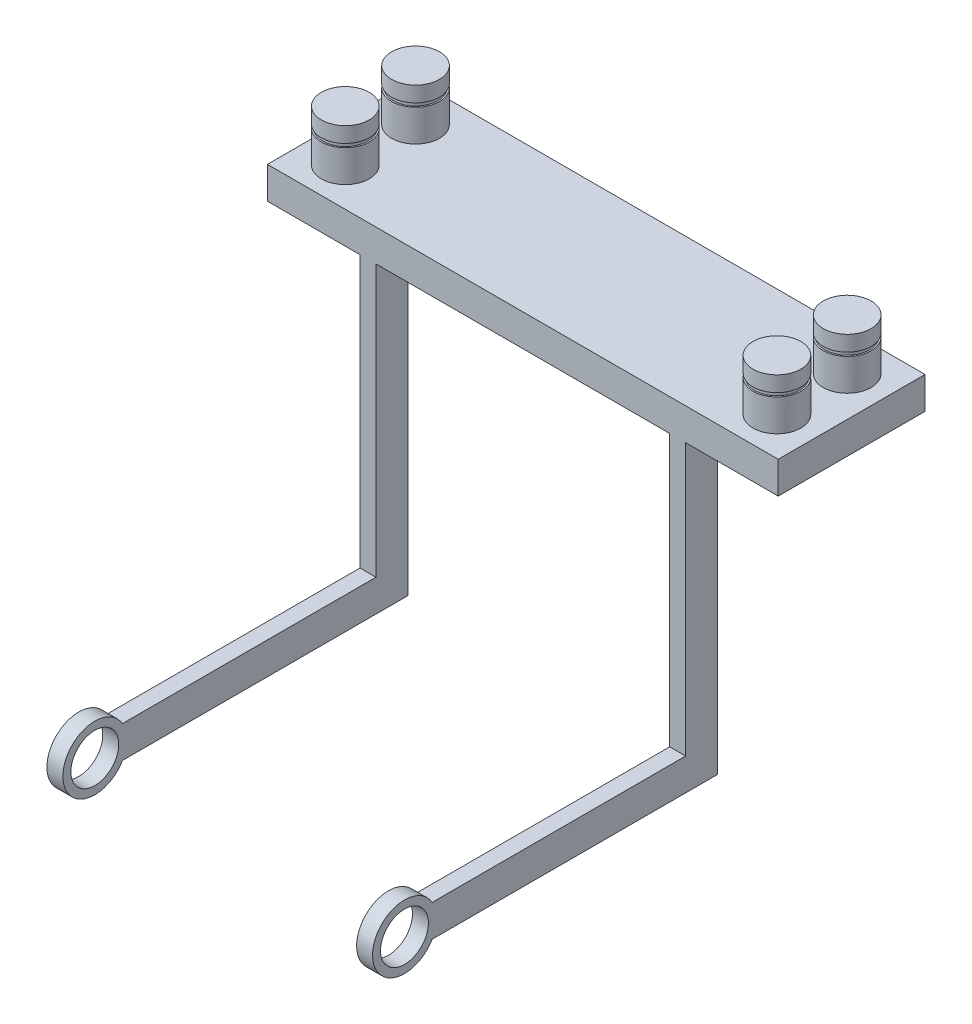
ISO-10303-21;
HEADER;
FILE_DESCRIPTION(('STEP AP214'),'2;1');
FILE_NAME('part.step','',(''),(''),'','','');
FILE_SCHEMA(('AUTOMOTIVE_DESIGN { 1 0 10303 214 1 1 1 1 }'));
ENDSEC;
DATA;
#1=APPLICATION_CONTEXT('core data for automotive mechanical design processes');
#2=APPLICATION_PROTOCOL_DEFINITION('international standard','automotive_design',2000,#1);
#3=PRODUCT_CONTEXT('',#1,'mechanical');
#4=PRODUCT('Part','Part','',(#3));
#5=PRODUCT_RELATED_PRODUCT_CATEGORY('part','',(#4));
#6=PRODUCT_DEFINITION_FORMATION('','',#4);
#7=PRODUCT_DEFINITION_CONTEXT('part definition',#1,'design');
#8=PRODUCT_DEFINITION('design','',#6,#7);
#9=PRODUCT_DEFINITION_SHAPE('','',#8);
#10=(LENGTH_UNIT() NAMED_UNIT(*) SI_UNIT(.MILLI.,.METRE.));
#11=(NAMED_UNIT(*) PLANE_ANGLE_UNIT() SI_UNIT($,.RADIAN.));
#12=(NAMED_UNIT(*) SI_UNIT($,.STERADIAN.) SOLID_ANGLE_UNIT());
#13=UNCERTAINTY_MEASURE_WITH_UNIT(LENGTH_MEASURE(1.E-05),#10,'distance_accuracy_value','');
#14=(GEOMETRIC_REPRESENTATION_CONTEXT(3) GLOBAL_UNCERTAINTY_ASSIGNED_CONTEXT((#13)) GLOBAL_UNIT_ASSIGNED_CONTEXT((#10,
#11,#12)) REPRESENTATION_CONTEXT('',''));
#15=CARTESIAN_POINT('',(0.,0.,0.));
#16=DIRECTION('',(0.,0.,1.));
#17=DIRECTION('',(1.,0.,0.));
#18=AXIS2_PLACEMENT_3D('',#15,#16,#17);
#19=CARTESIAN_POINT('',(-32.385,-60.325,0.));
#20=DIRECTION('',(-1.,0.,0.));
#21=DIRECTION('',(0.,0.,1.));
#22=AXIS2_PLACEMENT_3D('',#19,#20,#21);
#23=PLANE('',#22);
#24=DIRECTION('',(0.,0.,1.));
#25=VECTOR('',#24,1.);
#26=CARTESIAN_POINT('',(-32.385,-60.325,0.));
#27=LINE('',#26,#25);
#28=CARTESIAN_POINT('',(-32.385,-60.325,-6.35));
#29=VERTEX_POINT('',#28);
#30=CARTESIAN_POINT('',(-32.385,-60.325,50.4201086859688));
#31=VERTEX_POINT('',#30);
#32=EDGE_CURVE('E156',#29,#31,#27,.T.);
#33=ORIENTED_EDGE('',*,*,#32,.T.);
#34=CARTESIAN_POINT('',(-32.385,-57.15,55.91937));
#35=DIRECTION('',(-1.,0.,0.));
#36=DIRECTION('',(0.,0.,1.));
#37=AXIS2_PLACEMENT_3D('',#34,#35,#36);
#38=CIRCLE('',#37,6.35);
#39=CARTESIAN_POINT('',(-32.385,-53.975,50.4201086859688));
#40=VERTEX_POINT('',#39);
#41=EDGE_CURVE('E934',#31,#40,#38,.T.);
#42=ORIENTED_EDGE('',*,*,#41,.T.);
#43=DIRECTION('',(0.,0.,-1.));
#44=VECTOR('',#43,1.);
#45=CARTESIAN_POINT('',(-32.385,-53.975,55.91937));
#46=LINE('',#45,#44);
#47=CARTESIAN_POINT('',(-32.385,-53.975,0.));
#48=VERTEX_POINT('',#47);
#49=EDGE_CURVE('E928',#40,#48,#46,.T.);
#50=ORIENTED_EDGE('',*,*,#49,.T.);
#51=DIRECTION('',(0.,1.,0.));
#52=VECTOR('',#51,1.);
#53=CARTESIAN_POINT('',(-32.385,-60.325,0.));
#54=LINE('',#53,#52);
#55=CARTESIAN_POINT('',(-32.385,0.,0.));
#56=VERTEX_POINT('',#55);
#57=EDGE_CURVE('E164',#48,#56,#54,.T.);
#58=ORIENTED_EDGE('',*,*,#57,.T.);
#59=DIRECTION('',(0.,0.,1.));
#60=VECTOR('',#59,1.);
#61=CARTESIAN_POINT('',(-32.385,0.,0.));
#62=LINE('',#61,#60);
#63=CARTESIAN_POINT('',(-32.385,0.,-6.35));
#64=VERTEX_POINT('',#63);
#65=EDGE_CURVE('E159',#64,#56,#62,.T.);
#66=ORIENTED_EDGE('',*,*,#65,.F.);
#67=DIRECTION('',(0.,1.,0.));
#68=VECTOR('',#67,1.);
#69=CARTESIAN_POINT('',(-32.385,-60.325,-6.35));
#70=LINE('',#69,#68);
#71=EDGE_CURVE('E153',#29,#64,#70,.T.);
#72=ORIENTED_EDGE('',*,*,#71,.F.);
#73=EDGE_LOOP('',(#33,#42,#50,#58,#66,#72));
#74=FACE_BOUND('',#73,.T.);
#75=CARTESIAN_POINT('',(-32.385,-57.15,55.91937));
#76=DIRECTION('',(-1.,0.,0.));
#77=DIRECTION('',(0.,0.,1.));
#78=AXIS2_PLACEMENT_3D('',#75,#76,#77);
#79=CIRCLE('',#78,4.7625);
#80=CARTESIAN_POINT('',(-32.385,-57.15,60.68187));
#81=VERTEX_POINT('',#80);
#82=EDGE_CURVE('E941',#81,#81,#79,.T.);
#83=ORIENTED_EDGE('',*,*,#82,.F.);
#84=EDGE_LOOP('',(#83));
#85=FACE_BOUND('',#84,.T.);
#86=ADVANCED_FACE('F41',(#74,#85),#23,.T.);
#87=CARTESIAN_POINT('',(0.,-60.325,0.));
#88=DIRECTION('',(0.,-1.,0.));
#89=DIRECTION('',(0.,0.,-1.));
#90=AXIS2_PLACEMENT_3D('',#87,#88,#89);
#91=PLANE('',#90);
#92=DIRECTION('',(0.,0.,-1.));
#93=VECTOR('',#92,1.);
#94=CARTESIAN_POINT('',(-29.21,-60.325,0.));
#95=LINE('',#94,#93);
#96=CARTESIAN_POINT('',(-29.21,-60.325,50.4201086859688));
#97=VERTEX_POINT('',#96);
#98=CARTESIAN_POINT('',(-29.21,-60.325,-6.35));
#99=VERTEX_POINT('',#98);
#100=EDGE_CURVE('E62',#97,#99,#95,.T.);
#101=ORIENTED_EDGE('',*,*,#100,.F.);
#102=DIRECTION('',(1.,0.,0.));
#103=VECTOR('',#102,1.);
#104=CARTESIAN_POINT('',(-32.385,-60.325,50.4201086859688));
#105=LINE('',#104,#103);
#106=EDGE_CURVE('E57',#97,#31,#105,.F.);
#107=ORIENTED_EDGE('',*,*,#106,.T.);
#108=ORIENTED_EDGE('',*,*,#32,.F.);
#109=DIRECTION('',(-1.,0.,0.));
#110=VECTOR('',#109,1.);
#111=CARTESIAN_POINT('',(-29.21,-60.325,-6.35));
#112=LINE('',#111,#110);
#113=EDGE_CURVE('E168',#99,#29,#112,.T.);
#114=ORIENTED_EDGE('',*,*,#113,.F.);
#115=EDGE_LOOP('',(#101,#107,#108,#114));
#116=FACE_BOUND('',#115,.T.);
#117=ADVANCED_FACE('F167',(#116),#91,.T.);
#118=CARTESIAN_POINT('',(-29.21,-53.975,55.91937));
#119=DIRECTION('',(0.,1.,0.));
#120=DIRECTION('',(0.,0.,1.));
#121=AXIS2_PLACEMENT_3D('',#118,#119,#120);
#122=PLANE('',#121);
#123=ORIENTED_EDGE('',*,*,#49,.F.);
#124=DIRECTION('',(1.,0.,0.));
#125=VECTOR('',#124,1.);
#126=CARTESIAN_POINT('',(-32.385,-53.975,50.4201086859688));
#127=LINE('',#126,#125);
#128=CARTESIAN_POINT('',(-29.21,-53.975,50.4201086859688));
#129=VERTEX_POINT('',#128);
#130=EDGE_CURVE('E11',#40,#129,#127,.T.);
#131=ORIENTED_EDGE('',*,*,#130,.T.);
#132=DIRECTION('',(0.,0.,-1.));
#133=VECTOR('',#132,1.);
#134=CARTESIAN_POINT('',(-29.21,-53.975,55.91937));
#135=LINE('',#134,#133);
#136=CARTESIAN_POINT('',(-29.21,-53.975,0.));
#137=VERTEX_POINT('',#136);
#138=EDGE_CURVE('E183',#129,#137,#135,.T.);
#139=ORIENTED_EDGE('',*,*,#138,.T.);
#140=DIRECTION('',(1.,0.,0.));
#141=VECTOR('',#140,1.);
#142=CARTESIAN_POINT('',(-29.21,-53.975,0.));
#143=LINE('',#142,#141);
#144=EDGE_CURVE('E930',#48,#137,#143,.T.);
#145=ORIENTED_EDGE('',*,*,#144,.F.);
#146=EDGE_LOOP('',(#123,#131,#139,#145));
#147=FACE_BOUND('',#146,.T.);
#148=ADVANCED_FACE('F480',(#147),#122,.T.);
#149=CARTESIAN_POINT('',(0.,6.35,0.));
#150=DIRECTION('',(0.,0.,-1.));
#151=DIRECTION('',(-1.,0.,0.));
#152=AXIS2_PLACEMENT_3D('',#149,#150,#151);
#153=PLANE('',#152);
#154=ORIENTED_EDGE('',*,*,#57,.F.);
#155=ORIENTED_EDGE('',*,*,#144,.T.);
#156=DIRECTION('',(0.,1.,0.));
#157=VECTOR('',#156,1.);
#158=CARTESIAN_POINT('',(-29.21,-60.325,0.));
#159=LINE('',#158,#157);
#160=CARTESIAN_POINT('',(-29.21,0.,0.));
#161=VERTEX_POINT('',#160);
#162=EDGE_CURVE('E191',#137,#161,#159,.T.);
#163=ORIENTED_EDGE('',*,*,#162,.T.);
#164=DIRECTION('',(1.,0.,0.));
#165=VECTOR('',#164,1.);
#166=CARTESIAN_POINT('',(0.,0.,0.));
#167=LINE('',#166,#165);
#168=CARTESIAN_POINT('',(29.21,0.,0.));
#169=VERTEX_POINT('',#168);
#170=EDGE_CURVE('E382',#161,#169,#167,.T.);
#171=ORIENTED_EDGE('',*,*,#170,.T.);
#172=DIRECTION('',(0.,1.,0.));
#173=VECTOR('',#172,1.);
#174=CARTESIAN_POINT('',(29.21,-60.325,0.));
#175=LINE('',#174,#173);
#176=CARTESIAN_POINT('',(29.21,-53.975,0.));
#177=VERTEX_POINT('',#176);
#178=EDGE_CURVE('E299',#177,#169,#175,.T.);
#179=ORIENTED_EDGE('',*,*,#178,.F.);
#180=DIRECTION('',(-1.,0.,0.));
#181=VECTOR('',#180,1.);
#182=CARTESIAN_POINT('',(29.21,-53.975,0.));
#183=LINE('',#182,#181);
#184=CARTESIAN_POINT('',(32.385,-53.975,0.));
#185=VERTEX_POINT('',#184);
#186=EDGE_CURVE('E277',#185,#177,#183,.T.);
#187=ORIENTED_EDGE('',*,*,#186,.F.);
#188=DIRECTION('',(0.,1.,0.));
#189=VECTOR('',#188,1.);
#190=CARTESIAN_POINT('',(32.385,-60.325,0.));
#191=LINE('',#190,#189);
#192=CARTESIAN_POINT('',(32.385,0.,0.));
#193=VERTEX_POINT('',#192);
#194=EDGE_CURVE('E313',#185,#193,#191,.T.);
#195=ORIENTED_EDGE('',*,*,#194,.T.);
#196=CARTESIAN_POINT('',(50.8,0.,0.));
#197=VERTEX_POINT('',#196);
#198=EDGE_CURVE('E365',#193,#197,#167,.T.);
#199=ORIENTED_EDGE('',*,*,#198,.T.);
#200=DIRECTION('',(0.,-1.,0.));
#201=VECTOR('',#200,1.);
#202=CARTESIAN_POINT('',(50.8,6.35,0.));
#203=LINE('',#202,#201);
#204=CARTESIAN_POINT('',(50.8,6.35,0.));
#205=VERTEX_POINT('',#204);
#206=EDGE_CURVE('E390',#205,#197,#203,.T.);
#207=ORIENTED_EDGE('',*,*,#206,.F.);
#208=DIRECTION('',(1.,0.,0.));
#209=VECTOR('',#208,1.);
#210=CARTESIAN_POINT('',(0.,6.35,0.));
#211=LINE('',#210,#209);
#212=CARTESIAN_POINT('',(-50.8,6.35,0.));
#213=VERTEX_POINT('',#212);
#214=EDGE_CURVE('E366',#213,#205,#211,.T.);
#215=ORIENTED_EDGE('',*,*,#214,.F.);
#216=DIRECTION('',(0.,-1.,0.));
#217=VECTOR('',#216,1.);
#218=CARTESIAN_POINT('',(-50.8,6.35,0.));
#219=LINE('',#218,#217);
#220=CARTESIAN_POINT('',(-50.8,0.,0.));
#221=VERTEX_POINT('',#220);
#222=EDGE_CURVE('E247',#213,#221,#219,.T.);
#223=ORIENTED_EDGE('',*,*,#222,.T.);
#224=EDGE_CURVE('E377',#221,#56,#167,.T.);
#225=ORIENTED_EDGE('',*,*,#224,.T.);
#226=EDGE_LOOP('',(#154,#155,#163,#171,#179,#187,#195,#199,#207,#215,#223,#225));
#227=FACE_BOUND('',#226,.T.);
#228=ADVANCED_FACE('F43',(#227),#153,.F.);
#229=CARTESIAN_POINT('',(50.8,6.35,0.));
#230=DIRECTION('',(-1.,0.,0.));
#231=DIRECTION('',(0.,0.,1.));
#232=AXIS2_PLACEMENT_3D('',#229,#230,#231);
#233=PLANE('',#232);
#234=DIRECTION('',(0.,0.,-1.));
#235=VECTOR('',#234,1.);
#236=CARTESIAN_POINT('',(50.8,0.,0.));
#237=LINE('',#236,#235);
#238=CARTESIAN_POINT('',(50.8,0.,-29.21));
#239=VERTEX_POINT('',#238);
#240=EDGE_CURVE('E381',#197,#239,#237,.T.);
#241=ORIENTED_EDGE('',*,*,#240,.T.);
#242=DIRECTION('',(0.,-1.,0.));
#243=VECTOR('',#242,1.);
#244=CARTESIAN_POINT('',(50.8,6.35,-29.21));
#245=LINE('',#244,#243);
#246=CARTESIAN_POINT('',(50.8,6.35,-29.21));
#247=VERTEX_POINT('',#246);
#248=EDGE_CURVE('E376',#247,#239,#245,.T.);
#249=ORIENTED_EDGE('',*,*,#248,.F.);
#250=DIRECTION('',(0.,0.,-1.));
#251=VECTOR('',#250,1.);
#252=CARTESIAN_POINT('',(50.8,6.35,0.));
#253=LINE('',#252,#251);
#254=EDGE_CURVE('E369',#205,#247,#253,.T.);
#255=ORIENTED_EDGE('',*,*,#254,.F.);
#256=ORIENTED_EDGE('',*,*,#206,.T.);
#257=EDGE_LOOP('',(#241,#249,#255,#256));
#258=FACE_BOUND('',#257,.T.);
#259=ADVANCED_FACE('F460',(#258),#233,.F.);
#260=CARTESIAN_POINT('',(0.,6.35,-29.21));
#261=DIRECTION('',(0.,0.,1.));
#262=DIRECTION('',(1.,0.,0.));
#263=AXIS2_PLACEMENT_3D('',#260,#261,#262);
#264=PLANE('',#263);
#265=DIRECTION('',(-1.,0.,0.));
#266=VECTOR('',#265,1.);
#267=CARTESIAN_POINT('',(0.,0.,-29.21));
#268=LINE('',#267,#266);
#269=CARTESIAN_POINT('',(-50.8,0.,-29.21));
#270=VERTEX_POINT('',#269);
#271=EDGE_CURVE('E370',#239,#270,#268,.T.);
#272=ORIENTED_EDGE('',*,*,#271,.T.);
#273=DIRECTION('',(0.,-1.,0.));
#274=VECTOR('',#273,1.);
#275=CARTESIAN_POINT('',(-50.8,6.35,-29.21));
#276=LINE('',#275,#274);
#277=CARTESIAN_POINT('',(-50.8,6.35,-29.21));
#278=VERTEX_POINT('',#277);
#279=EDGE_CURVE('E254',#278,#270,#276,.T.);
#280=ORIENTED_EDGE('',*,*,#279,.F.);
#281=DIRECTION('',(-1.,0.,0.));
#282=VECTOR('',#281,1.);
#283=CARTESIAN_POINT('',(0.,6.35,-29.21));
#284=LINE('',#283,#282);
#285=EDGE_CURVE('E373',#247,#278,#284,.T.);
#286=ORIENTED_EDGE('',*,*,#285,.F.);
#287=ORIENTED_EDGE('',*,*,#248,.T.);
#288=EDGE_LOOP('',(#272,#280,#286,#287));
#289=FACE_BOUND('',#288,.T.);
#290=ADVANCED_FACE('F455',(#289),#264,.F.);
#291=CARTESIAN_POINT('',(0.,6.35,0.));
#292=DIRECTION('',(0.,-1.,0.));
#293=DIRECTION('',(0.,0.,-1.));
#294=AXIS2_PLACEMENT_3D('',#291,#292,#293);
#295=PLANE('',#294);
#296=CARTESIAN_POINT('',(-42.926,6.35,-21.59));
#297=DIRECTION('',(0.,-1.,0.));
#298=DIRECTION('',(0.,0.,1.));
#299=AXIS2_PLACEMENT_3D('',#296,#297,#298);
#300=CIRCLE('',#299,4.7625);
#301=CARTESIAN_POINT('',(-42.926,6.35,-16.8275));
#302=VERTEX_POINT('',#301);
#303=EDGE_CURVE('E226',#302,#302,#300,.T.);
#304=ORIENTED_EDGE('',*,*,#303,.T.);
#305=EDGE_LOOP('',(#304));
#306=FACE_BOUND('',#305,.T.);
#307=CARTESIAN_POINT('',(-42.926,6.35,-7.62));
#308=DIRECTION('',(0.,-1.,0.));
#309=DIRECTION('',(0.,0.,1.));
#310=AXIS2_PLACEMENT_3D('',#307,#308,#309);
#311=CIRCLE('',#310,4.7625);
#312=CARTESIAN_POINT('',(-42.926,6.35,-2.8575));
#313=VERTEX_POINT('',#312);
#314=EDGE_CURVE('E231',#313,#313,#311,.T.);
#315=ORIENTED_EDGE('',*,*,#314,.T.);
#316=EDGE_LOOP('',(#315));
#317=FACE_BOUND('',#316,.T.);
#318=CARTESIAN_POINT('',(42.926,6.35,-21.59));
#319=DIRECTION('',(0.,-1.,0.));
#320=DIRECTION('',(0.,0.,-1.));
#321=AXIS2_PLACEMENT_3D('',#318,#319,#320);
#322=CIRCLE('',#321,4.7625);
#323=CARTESIAN_POINT('',(42.926,6.35,-26.3525));
#324=VERTEX_POINT('',#323);
#325=EDGE_CURVE('E357',#324,#324,#322,.F.);
#326=ORIENTED_EDGE('',*,*,#325,.F.);
#327=EDGE_LOOP('',(#326));
#328=FACE_BOUND('',#327,.T.);
#329=CARTESIAN_POINT('',(42.926,6.35,-7.62));
#330=DIRECTION('',(0.,-1.,0.));
#331=DIRECTION('',(0.,0.,-1.));
#332=AXIS2_PLACEMENT_3D('',#329,#330,#331);
#333=CIRCLE('',#332,4.7625);
#334=CARTESIAN_POINT('',(42.926,6.35,-12.3825));
#335=VERTEX_POINT('',#334);
#336=EDGE_CURVE('E394',#335,#335,#333,.F.);
#337=ORIENTED_EDGE('',*,*,#336,.F.);
#338=EDGE_LOOP('',(#337));
#339=FACE_BOUND('',#338,.T.);
#340=ORIENTED_EDGE('',*,*,#285,.T.);
#341=DIRECTION('',(0.,0.,-1.));
#342=VECTOR('',#341,1.);
#343=CARTESIAN_POINT('',(-50.8,6.35,0.));
#344=LINE('',#343,#342);
#345=EDGE_CURVE('E243',#213,#278,#344,.T.);
#346=ORIENTED_EDGE('',*,*,#345,.F.);
#347=ORIENTED_EDGE('',*,*,#214,.T.);
#348=ORIENTED_EDGE('',*,*,#254,.T.);
#349=EDGE_LOOP('',(#340,#346,#347,#348));
#350=FACE_BOUND('',#349,.T.);
#351=ADVANCED_FACE('F462',(#306,#317,#328,#339,#350),#295,.F.);
#352=CARTESIAN_POINT('',(0.,0.,0.));
#353=DIRECTION('',(0.,-1.,0.));
#354=DIRECTION('',(0.,0.,-1.));
#355=AXIS2_PLACEMENT_3D('',#352,#353,#354);
#356=PLANE('',#355);
#357=DIRECTION('',(0.,0.,-1.));
#358=VECTOR('',#357,1.);
#359=CARTESIAN_POINT('',(-29.21,0.,0.));
#360=LINE('',#359,#358);
#361=CARTESIAN_POINT('',(-29.21,0.,-6.35));
#362=VERTEX_POINT('',#361);
#363=EDGE_CURVE('E180',#161,#362,#360,.T.);
#364=ORIENTED_EDGE('',*,*,#363,.T.);
#365=DIRECTION('',(-1.,0.,0.));
#366=VECTOR('',#365,1.);
#367=CARTESIAN_POINT('',(-29.21,0.,-6.35));
#368=LINE('',#367,#366);
#369=EDGE_CURVE('E186',#362,#64,#368,.T.);
#370=ORIENTED_EDGE('',*,*,#369,.T.);
#371=ORIENTED_EDGE('',*,*,#65,.T.);
#372=ORIENTED_EDGE('',*,*,#224,.F.);
#373=DIRECTION('',(0.,0.,-1.));
#374=VECTOR('',#373,1.);
#375=CARTESIAN_POINT('',(-50.8,0.,0.));
#376=LINE('',#375,#374);
#377=EDGE_CURVE('E239',#221,#270,#376,.T.);
#378=ORIENTED_EDGE('',*,*,#377,.T.);
#379=ORIENTED_EDGE('',*,*,#271,.F.);
#380=ORIENTED_EDGE('',*,*,#240,.F.);
#381=ORIENTED_EDGE('',*,*,#198,.F.);
#382=DIRECTION('',(0.,0.,1.));
#383=VECTOR('',#382,1.);
#384=CARTESIAN_POINT('',(32.385,0.,0.));
#385=LINE('',#384,#383);
#386=CARTESIAN_POINT('',(32.385,0.,-6.35));
#387=VERTEX_POINT('',#386);
#388=EDGE_CURVE('E292',#387,#193,#385,.T.);
#389=ORIENTED_EDGE('',*,*,#388,.F.);
#390=DIRECTION('',(1.,0.,0.));
#391=VECTOR('',#390,1.);
#392=CARTESIAN_POINT('',(29.21,0.,-6.35));
#393=LINE('',#392,#391);
#394=CARTESIAN_POINT('',(29.21,0.,-6.35));
#395=VERTEX_POINT('',#394);
#396=EDGE_CURVE('E303',#395,#387,#393,.T.);
#397=ORIENTED_EDGE('',*,*,#396,.F.);
#398=DIRECTION('',(0.,0.,-1.));
#399=VECTOR('',#398,1.);
#400=CARTESIAN_POINT('',(29.21,0.,0.));
#401=LINE('',#400,#399);
#402=EDGE_CURVE('E287',#169,#395,#401,.T.);
#403=ORIENTED_EDGE('',*,*,#402,.F.);
#404=ORIENTED_EDGE('',*,*,#170,.F.);
#405=EDGE_LOOP('',(#364,#370,#371,#372,#378,#379,#380,#381,#389,#397,#403,#404));
#406=FACE_BOUND('',#405,.T.);
#407=ADVANCED_FACE('F429',(#406),#356,.T.);
#408=CARTESIAN_POINT('',(42.926,12.7,-7.62));
#409=DIRECTION('',(0.,-1.,0.));
#410=DIRECTION('',(0.,0.,-1.));
#411=AXIS2_PLACEMENT_3D('',#408,#409,#410);
#412=CYLINDRICAL_SURFACE('',#411,4.7625);
#413=CARTESIAN_POINT('',(42.926,12.7,-7.62));
#414=DIRECTION('',(0.,1.,0.));
#415=DIRECTION('',(0.,0.,1.));
#416=AXIS2_PLACEMENT_3D('',#413,#414,#415);
#417=CIRCLE('',#416,4.7625);
#418=CARTESIAN_POINT('',(42.926,12.7,-2.8575));
#419=VERTEX_POINT('',#418);
#420=EDGE_CURVE('E361',#419,#419,#417,.T.);
#421=ORIENTED_EDGE('',*,*,#420,.F.);
#422=EDGE_LOOP('',(#421));
#423=FACE_BOUND('',#422,.T.);
#424=ORIENTED_EDGE('',*,*,#336,.T.);
#425=EDGE_LOOP('',(#424));
#426=FACE_BOUND('',#425,.T.);
#427=ADVANCED_FACE('F470',(#423,#426),#412,.T.);
#428=CARTESIAN_POINT('',(42.926,12.7,-7.62));
#429=DIRECTION('',(0.,1.,0.));
#430=DIRECTION('',(0.,0.,1.));
#431=AXIS2_PLACEMENT_3D('',#428,#429,#430);
#432=PLANE('',#431);
#433=CARTESIAN_POINT('',(42.926,12.7,-7.62));
#434=DIRECTION('',(0.,1.,0.));
#435=DIRECTION('',(0.,0.,1.));
#436=AXIS2_PLACEMENT_3D('',#433,#434,#435);
#437=CIRCLE('',#436,4.4704);
#438=CARTESIAN_POINT('',(42.926,12.7,-3.1496));
#439=VERTEX_POINT('',#438);
#440=EDGE_CURVE('E345',#439,#439,#437,.T.);
#441=ORIENTED_EDGE('',*,*,#440,.F.);
#442=EDGE_LOOP('',(#441));
#443=FACE_BOUND('',#442,.T.);
#444=ORIENTED_EDGE('',*,*,#420,.T.);
#445=EDGE_LOOP('',(#444));
#446=FACE_BOUND('',#445,.T.);
#447=ADVANCED_FACE('F591',(#443,#446),#432,.T.);
#448=CARTESIAN_POINT('',(42.926,12.7,-21.59));
#449=DIRECTION('',(0.,-1.,0.));
#450=DIRECTION('',(0.,0.,-1.));
#451=AXIS2_PLACEMENT_3D('',#448,#449,#450);
#452=CYLINDRICAL_SURFACE('',#451,4.7625);
#453=CARTESIAN_POINT('',(42.926,12.7,-21.59));
#454=DIRECTION('',(0.,1.,0.));
#455=DIRECTION('',(0.,0.,1.));
#456=AXIS2_PLACEMENT_3D('',#453,#454,#455);
#457=CIRCLE('',#456,4.7625);
#458=CARTESIAN_POINT('',(42.926,12.7,-16.8275));
#459=VERTEX_POINT('',#458);
#460=EDGE_CURVE('E353',#459,#459,#457,.T.);
#461=ORIENTED_EDGE('',*,*,#460,.F.);
#462=EDGE_LOOP('',(#461));
#463=FACE_BOUND('',#462,.T.);
#464=ORIENTED_EDGE('',*,*,#325,.T.);
#465=EDGE_LOOP('',(#464));
#466=FACE_BOUND('',#465,.T.);
#467=ADVANCED_FACE('F587',(#463,#466),#452,.T.);
#468=CARTESIAN_POINT('',(42.926,12.7,-21.59));
#469=DIRECTION('',(0.,1.,0.));
#470=DIRECTION('',(0.,0.,1.));
#471=AXIS2_PLACEMENT_3D('',#468,#469,#470);
#472=PLANE('',#471);
#473=CARTESIAN_POINT('',(42.926,12.7,-21.59));
#474=DIRECTION('',(0.,1.,0.));
#475=DIRECTION('',(0.,0.,1.));
#476=AXIS2_PLACEMENT_3D('',#473,#474,#475);
#477=CIRCLE('',#476,4.4704);
#478=CARTESIAN_POINT('',(42.926,12.7,-17.1196));
#479=VERTEX_POINT('',#478);
#480=EDGE_CURVE('E349',#479,#479,#477,.T.);
#481=ORIENTED_EDGE('',*,*,#480,.F.);
#482=EDGE_LOOP('',(#481));
#483=FACE_BOUND('',#482,.T.);
#484=ORIENTED_EDGE('',*,*,#460,.T.);
#485=EDGE_LOOP('',(#484));
#486=FACE_BOUND('',#485,.T.);
#487=ADVANCED_FACE('F583',(#483,#486),#472,.T.);
#488=CARTESIAN_POINT('',(42.926,13.4366,-21.59));
#489=DIRECTION('',(0.,-1.,0.));
#490=DIRECTION('',(0.,0.,-1.));
#491=AXIS2_PLACEMENT_3D('',#488,#489,#490);
#492=CYLINDRICAL_SURFACE('',#491,4.4704);
#493=CARTESIAN_POINT('',(42.926,13.4366,-21.59));
#494=DIRECTION('',(0.,1.,0.));
#495=DIRECTION('',(0.,0.,1.));
#496=AXIS2_PLACEMENT_3D('',#493,#494,#495);
#497=CIRCLE('',#496,4.4704);
#498=CARTESIAN_POINT('',(42.926,13.4366,-17.1196));
#499=VERTEX_POINT('',#498);
#500=EDGE_CURVE('E344',#499,#499,#497,.T.);
#501=ORIENTED_EDGE('',*,*,#500,.F.);
#502=EDGE_LOOP('',(#501));
#503=FACE_BOUND('',#502,.T.);
#504=ORIENTED_EDGE('',*,*,#480,.T.);
#505=EDGE_LOOP('',(#504));
#506=FACE_BOUND('',#505,.T.);
#507=ADVANCED_FACE('F579',(#503,#506),#492,.T.);
#508=CARTESIAN_POINT('',(42.926,13.4366,-7.62));
#509=DIRECTION('',(0.,-1.,0.));
#510=DIRECTION('',(0.,0.,-1.));
#511=AXIS2_PLACEMENT_3D('',#508,#509,#510);
#512=CYLINDRICAL_SURFACE('',#511,4.4704);
#513=CARTESIAN_POINT('',(42.926,13.4366,-7.62));
#514=DIRECTION('',(0.,1.,0.));
#515=DIRECTION('',(0.,0.,1.));
#516=AXIS2_PLACEMENT_3D('',#513,#514,#515);
#517=CIRCLE('',#516,4.4704);
#518=CARTESIAN_POINT('',(42.926,13.4366,-3.1496));
#519=VERTEX_POINT('',#518);
#520=EDGE_CURVE('E337',#519,#519,#517,.T.);
#521=ORIENTED_EDGE('',*,*,#520,.F.);
#522=EDGE_LOOP('',(#521));
#523=FACE_BOUND('',#522,.T.);
#524=ORIENTED_EDGE('',*,*,#440,.T.);
#525=EDGE_LOOP('',(#524));
#526=FACE_BOUND('',#525,.T.);
#527=ADVANCED_FACE('F575',(#523,#526),#512,.T.);
#528=CARTESIAN_POINT('',(42.926,16.51,-21.59));
#529=DIRECTION('',(0.,-1.,0.));
#530=DIRECTION('',(0.,0.,-1.));
#531=AXIS2_PLACEMENT_3D('',#528,#529,#530);
#532=CYLINDRICAL_SURFACE('',#531,4.7625);
#533=CARTESIAN_POINT('',(42.926,16.51,-21.59));
#534=DIRECTION('',(0.,1.,0.));
#535=DIRECTION('',(0.,0.,1.));
#536=AXIS2_PLACEMENT_3D('',#533,#534,#535);
#537=CIRCLE('',#536,4.7625);
#538=CARTESIAN_POINT('',(42.926,16.51,-16.8275));
#539=VERTEX_POINT('',#538);
#540=EDGE_CURVE('E333',#539,#539,#537,.T.);
#541=ORIENTED_EDGE('',*,*,#540,.F.);
#542=EDGE_LOOP('',(#541));
#543=FACE_BOUND('',#542,.T.);
#544=CARTESIAN_POINT('',(42.926,13.4366,-21.59));
#545=DIRECTION('',(0.,1.,0.));
#546=DIRECTION('',(0.,0.,1.));
#547=AXIS2_PLACEMENT_3D('',#544,#545,#546);
#548=CIRCLE('',#547,4.7625);
#549=CARTESIAN_POINT('',(42.926,13.4366,-16.8275));
#550=VERTEX_POINT('',#549);
#551=EDGE_CURVE('E329',#550,#550,#548,.T.);
#552=ORIENTED_EDGE('',*,*,#551,.T.);
#553=EDGE_LOOP('',(#552));
#554=FACE_BOUND('',#553,.T.);
#555=ADVANCED_FACE('F568',(#543,#554),#532,.T.);
#556=CARTESIAN_POINT('',(42.926,16.51,-21.59));
#557=DIRECTION('',(0.,1.,0.));
#558=DIRECTION('',(0.,0.,1.));
#559=AXIS2_PLACEMENT_3D('',#556,#557,#558);
#560=PLANE('',#559);
#561=ORIENTED_EDGE('',*,*,#540,.T.);
#562=EDGE_LOOP('',(#561));
#563=FACE_BOUND('',#562,.T.);
#564=ADVANCED_FACE('F565',(#563),#560,.T.);
#565=CARTESIAN_POINT('',(42.926,13.4366,-21.59));
#566=DIRECTION('',(0.,1.,0.));
#567=DIRECTION('',(0.,0.,1.));
#568=AXIS2_PLACEMENT_3D('',#565,#566,#567);
#569=PLANE('',#568);
#570=ORIENTED_EDGE('',*,*,#500,.T.);
#571=EDGE_LOOP('',(#570));
#572=FACE_BOUND('',#571,.T.);
#573=ORIENTED_EDGE('',*,*,#551,.F.);
#574=EDGE_LOOP('',(#573));
#575=FACE_BOUND('',#574,.T.);
#576=ADVANCED_FACE('F563',(#572,#575),#569,.F.);
#577=CARTESIAN_POINT('',(42.926,16.51,-7.62));
#578=DIRECTION('',(0.,-1.,0.));
#579=DIRECTION('',(0.,0.,-1.));
#580=AXIS2_PLACEMENT_3D('',#577,#578,#579);
#581=CYLINDRICAL_SURFACE('',#580,4.7625);
#582=CARTESIAN_POINT('',(42.926,16.51,-7.62));
#583=DIRECTION('',(0.,1.,0.));
#584=DIRECTION('',(0.,0.,1.));
#585=AXIS2_PLACEMENT_3D('',#582,#583,#584);
#586=CIRCLE('',#585,4.7625);
#587=CARTESIAN_POINT('',(42.926,16.51,-2.8575));
#588=VERTEX_POINT('',#587);
#589=EDGE_CURVE('E325',#588,#588,#586,.T.);
#590=ORIENTED_EDGE('',*,*,#589,.F.);
#591=EDGE_LOOP('',(#590));
#592=FACE_BOUND('',#591,.T.);
#593=CARTESIAN_POINT('',(42.926,13.4366,-7.62));
#594=DIRECTION('',(0.,1.,0.));
#595=DIRECTION('',(0.,0.,1.));
#596=AXIS2_PLACEMENT_3D('',#593,#594,#595);
#597=CIRCLE('',#596,4.7625);
#598=CARTESIAN_POINT('',(42.926,13.4366,-2.8575));
#599=VERTEX_POINT('',#598);
#600=EDGE_CURVE('E324',#599,#599,#597,.T.);
#601=ORIENTED_EDGE('',*,*,#600,.T.);
#602=EDGE_LOOP('',(#601));
#603=FACE_BOUND('',#602,.T.);
#604=ADVANCED_FACE('F556',(#592,#603),#581,.T.);
#605=CARTESIAN_POINT('',(42.926,16.51,-7.62));
#606=DIRECTION('',(0.,1.,0.));
#607=DIRECTION('',(0.,0.,1.));
#608=AXIS2_PLACEMENT_3D('',#605,#606,#607);
#609=PLANE('',#608);
#610=ORIENTED_EDGE('',*,*,#589,.T.);
#611=EDGE_LOOP('',(#610));
#612=FACE_BOUND('',#611,.T.);
#613=ADVANCED_FACE('F553',(#612),#609,.T.);
#614=CARTESIAN_POINT('',(42.926,13.4366,-7.62));
#615=DIRECTION('',(0.,1.,0.));
#616=DIRECTION('',(0.,0.,1.));
#617=AXIS2_PLACEMENT_3D('',#614,#615,#616);
#618=PLANE('',#617);
#619=ORIENTED_EDGE('',*,*,#520,.T.);
#620=EDGE_LOOP('',(#619));
#621=FACE_BOUND('',#620,.T.);
#622=ORIENTED_EDGE('',*,*,#600,.F.);
#623=EDGE_LOOP('',(#622));
#624=FACE_BOUND('',#623,.T.);
#625=ADVANCED_FACE('F552',(#621,#624),#618,.F.);
#626=CARTESIAN_POINT('',(29.21,-60.325,0.));
#627=DIRECTION('',(1.,0.,0.));
#628=DIRECTION('',(0.,0.,-1.));
#629=AXIS2_PLACEMENT_3D('',#626,#627,#628);
#630=PLANE('',#629);
#631=DIRECTION('',(0.,0.,-1.));
#632=VECTOR('',#631,1.);
#633=CARTESIAN_POINT('',(29.21,-60.325,0.));
#634=LINE('',#633,#632);
#635=CARTESIAN_POINT('',(29.21,-60.325,50.4201086859688));
#636=VERTEX_POINT('',#635);
#637=CARTESIAN_POINT('',(29.21,-60.325,-6.35));
#638=VERTEX_POINT('',#637);
#639=EDGE_CURVE('E288',#636,#638,#634,.T.);
#640=ORIENTED_EDGE('',*,*,#639,.F.);
#641=CARTESIAN_POINT('',(29.21,-57.15,55.91937));
#642=DIRECTION('',(-1.,0.,0.));
#643=DIRECTION('',(0.,0.,1.));
#644=AXIS2_PLACEMENT_3D('',#641,#642,#643);
#645=CIRCLE('',#644,6.35);
#646=CARTESIAN_POINT('',(29.21,-53.975,50.4201086859688));
#647=VERTEX_POINT('',#646);
#648=EDGE_CURVE('E263',#636,#647,#645,.T.);
#649=ORIENTED_EDGE('',*,*,#648,.T.);
#650=DIRECTION('',(0.,0.,-1.));
#651=VECTOR('',#650,1.);
#652=CARTESIAN_POINT('',(29.21,-53.975,55.91937));
#653=LINE('',#652,#651);
#654=EDGE_CURVE('E281',#647,#177,#653,.T.);
#655=ORIENTED_EDGE('',*,*,#654,.T.);
#656=ORIENTED_EDGE('',*,*,#178,.T.);
#657=ORIENTED_EDGE('',*,*,#402,.T.);
#658=DIRECTION('',(0.,1.,0.));
#659=VECTOR('',#658,1.);
#660=CARTESIAN_POINT('',(29.21,-60.325,-6.35));
#661=LINE('',#660,#659);
#662=EDGE_CURVE('E320',#638,#395,#661,.T.);
#663=ORIENTED_EDGE('',*,*,#662,.F.);
#664=EDGE_LOOP('',(#640,#649,#655,#656,#657,#663));
#665=FACE_BOUND('',#664,.T.);
#666=CARTESIAN_POINT('',(29.21,-57.15,55.91937));
#667=DIRECTION('',(-1.,0.,0.));
#668=DIRECTION('',(0.,0.,1.));
#669=AXIS2_PLACEMENT_3D('',#666,#667,#668);
#670=CIRCLE('',#669,4.7625);
#671=CARTESIAN_POINT('',(29.21,-57.15,60.68187));
#672=VERTEX_POINT('',#671);
#673=EDGE_CURVE('E258',#672,#672,#670,.T.);
#674=ORIENTED_EDGE('',*,*,#673,.F.);
#675=EDGE_LOOP('',(#674));
#676=FACE_BOUND('',#675,.T.);
#677=ADVANCED_FACE('F421',(#665,#676),#630,.F.);
#678=CARTESIAN_POINT('',(29.21,-60.325,-6.35));
#679=DIRECTION('',(0.,0.,1.));
#680=DIRECTION('',(1.,0.,0.));
#681=AXIS2_PLACEMENT_3D('',#678,#679,#680);
#682=PLANE('',#681);
#683=ORIENTED_EDGE('',*,*,#396,.T.);
#684=DIRECTION('',(0.,1.,0.));
#685=VECTOR('',#684,1.);
#686=CARTESIAN_POINT('',(32.385,-60.325,-6.35));
#687=LINE('',#686,#685);
#688=CARTESIAN_POINT('',(32.385,-60.325,-6.35));
#689=VERTEX_POINT('',#688);
#690=EDGE_CURVE('E316',#689,#387,#687,.T.);
#691=ORIENTED_EDGE('',*,*,#690,.F.);
#692=DIRECTION('',(1.,0.,0.));
#693=VECTOR('',#692,1.);
#694=CARTESIAN_POINT('',(29.21,-60.325,-6.35));
#695=LINE('',#694,#693);
#696=EDGE_CURVE('E291',#638,#689,#695,.T.);
#697=ORIENTED_EDGE('',*,*,#696,.F.);
#698=ORIENTED_EDGE('',*,*,#662,.T.);
#699=EDGE_LOOP('',(#683,#691,#697,#698));
#700=FACE_BOUND('',#699,.T.);
#701=ADVANCED_FACE('F425',(#700),#682,.F.);
#702=CARTESIAN_POINT('',(32.385,-60.325,0.));
#703=DIRECTION('',(-1.,0.,0.));
#704=DIRECTION('',(0.,0.,1.));
#705=AXIS2_PLACEMENT_3D('',#702,#703,#704);
#706=PLANE('',#705);
#707=DIRECTION('',(0.,0.,-1.));
#708=VECTOR('',#707,1.);
#709=CARTESIAN_POINT('',(32.385,-53.975,55.91937));
#710=LINE('',#709,#708);
#711=CARTESIAN_POINT('',(32.385,-53.975,50.4201086859688));
#712=VERTEX_POINT('',#711);
#713=EDGE_CURVE('E284',#712,#185,#710,.T.);
#714=ORIENTED_EDGE('',*,*,#713,.F.);
#715=CARTESIAN_POINT('',(32.385,-57.15,55.91937));
#716=DIRECTION('',(-1.,0.,0.));
#717=DIRECTION('',(0.,0.,1.));
#718=AXIS2_PLACEMENT_3D('',#715,#716,#717);
#719=CIRCLE('',#718,6.35);
#720=CARTESIAN_POINT('',(32.385,-60.325,50.4201086859688));
#721=VERTEX_POINT('',#720);
#722=EDGE_CURVE('E267',#721,#712,#719,.T.);
#723=ORIENTED_EDGE('',*,*,#722,.F.);
#724=DIRECTION('',(0.,0.,1.));
#725=VECTOR('',#724,1.);
#726=CARTESIAN_POINT('',(32.385,-60.325,0.));
#727=LINE('',#726,#725);
#728=EDGE_CURVE('E295',#689,#721,#727,.T.);
#729=ORIENTED_EDGE('',*,*,#728,.F.);
#730=ORIENTED_EDGE('',*,*,#690,.T.);
#731=ORIENTED_EDGE('',*,*,#388,.T.);
#732=ORIENTED_EDGE('',*,*,#194,.F.);
#733=EDGE_LOOP('',(#714,#723,#729,#730,#731,#732));
#734=FACE_BOUND('',#733,.T.);
#735=CARTESIAN_POINT('',(32.385,-57.15,55.91937));
#736=DIRECTION('',(-1.,0.,0.));
#737=DIRECTION('',(0.,0.,1.));
#738=AXIS2_PLACEMENT_3D('',#735,#736,#737);
#739=CIRCLE('',#738,4.7625);
#740=CARTESIAN_POINT('',(32.385,-57.15,60.68187));
#741=VERTEX_POINT('',#740);
#742=EDGE_CURVE('E259',#741,#741,#739,.T.);
#743=ORIENTED_EDGE('',*,*,#742,.T.);
#744=EDGE_LOOP('',(#743));
#745=FACE_BOUND('',#744,.T.);
#746=ADVANCED_FACE('F410',(#734,#745),#706,.F.);
#747=CARTESIAN_POINT('',(0.,-60.325,0.));
#748=DIRECTION('',(0.,-1.,0.));
#749=DIRECTION('',(0.,0.,-1.));
#750=AXIS2_PLACEMENT_3D('',#747,#748,#749);
#751=PLANE('',#750);
#752=DIRECTION('',(-1.,0.,0.));
#753=VECTOR('',#752,1.);
#754=CARTESIAN_POINT('',(32.385,-60.325,50.4201086859688));
#755=LINE('',#754,#753);
#756=EDGE_CURVE('E271',#636,#721,#755,.F.);
#757=ORIENTED_EDGE('',*,*,#756,.F.);
#758=ORIENTED_EDGE('',*,*,#639,.T.);
#759=ORIENTED_EDGE('',*,*,#696,.T.);
#760=ORIENTED_EDGE('',*,*,#728,.T.);
#761=EDGE_LOOP('',(#757,#758,#759,#760));
#762=FACE_BOUND('',#761,.T.);
#763=ADVANCED_FACE('F417',(#762),#751,.T.);
#764=CARTESIAN_POINT('',(29.21,-53.975,55.91937));
#765=DIRECTION('',(0.,-1.,0.));
#766=DIRECTION('',(0.,0.,-1.));
#767=AXIS2_PLACEMENT_3D('',#764,#765,#766);
#768=PLANE('',#767);
#769=ORIENTED_EDGE('',*,*,#654,.F.);
#770=DIRECTION('',(-1.,0.,0.));
#771=VECTOR('',#770,1.);
#772=CARTESIAN_POINT('',(32.385,-53.975,50.4201086859688));
#773=LINE('',#772,#771);
#774=EDGE_CURVE('E50',#647,#712,#773,.F.);
#775=ORIENTED_EDGE('',*,*,#774,.T.);
#776=ORIENTED_EDGE('',*,*,#713,.T.);
#777=ORIENTED_EDGE('',*,*,#186,.T.);
#778=EDGE_LOOP('',(#769,#775,#776,#777));
#779=FACE_BOUND('',#778,.T.);
#780=ADVANCED_FACE('F404',(#779),#768,.F.);
#781=CARTESIAN_POINT('',(32.385,-57.15,55.91937));
#782=DIRECTION('',(-1.,0.,0.));
#783=DIRECTION('',(0.,0.,1.));
#784=AXIS2_PLACEMENT_3D('',#781,#782,#783);
#785=CYLINDRICAL_SURFACE('',#784,6.35);
#786=ORIENTED_EDGE('',*,*,#648,.F.);
#787=ORIENTED_EDGE('',*,*,#756,.T.);
#788=ORIENTED_EDGE('',*,*,#722,.T.);
#789=ORIENTED_EDGE('',*,*,#774,.F.);
#790=EDGE_LOOP('',(#786,#787,#788,#789));
#791=FACE_BOUND('',#790,.T.);
#792=ADVANCED_FACE('F413',(#791),#785,.T.);
#793=CARTESIAN_POINT('',(32.385,-57.15,55.91937));
#794=DIRECTION('',(-1.,0.,0.));
#795=DIRECTION('',(0.,0.,1.));
#796=AXIS2_PLACEMENT_3D('',#793,#794,#795);
#797=CYLINDRICAL_SURFACE('',#796,4.7625);
#798=ORIENTED_EDGE('',*,*,#742,.F.);
#799=EDGE_LOOP('',(#798));
#800=FACE_BOUND('',#799,.T.);
#801=ORIENTED_EDGE('',*,*,#673,.T.);
#802=EDGE_LOOP('',(#801));
#803=FACE_BOUND('',#802,.T.);
#804=ADVANCED_FACE('F536',(#800,#803),#797,.F.);
#805=CARTESIAN_POINT('',(-50.8,6.35,0.));
#806=DIRECTION('',(-1.,0.,0.));
#807=DIRECTION('',(0.,0.,1.));
#808=AXIS2_PLACEMENT_3D('',#805,#806,#807);
#809=PLANE('',#808);
#810=ORIENTED_EDGE('',*,*,#377,.F.);
#811=ORIENTED_EDGE('',*,*,#222,.F.);
#812=ORIENTED_EDGE('',*,*,#345,.T.);
#813=ORIENTED_EDGE('',*,*,#279,.T.);
#814=EDGE_LOOP('',(#810,#811,#812,#813));
#815=FACE_BOUND('',#814,.T.);
#816=ADVANCED_FACE('F452',(#815),#809,.T.);
#817=CARTESIAN_POINT('',(-42.926,12.7,-7.62));
#818=DIRECTION('',(0.,-1.,0.));
#819=DIRECTION('',(0.,0.,-1.));
#820=AXIS2_PLACEMENT_3D('',#817,#818,#819);
#821=CYLINDRICAL_SURFACE('',#820,4.7625);
#822=CARTESIAN_POINT('',(-42.926,12.7,-7.62));
#823=DIRECTION('',(0.,-1.,0.));
#824=DIRECTION('',(0.,0.,1.));
#825=AXIS2_PLACEMENT_3D('',#822,#823,#824);
#826=CIRCLE('',#825,4.7625);
#827=CARTESIAN_POINT('',(-42.926,12.7,-2.8575));
#828=VERTEX_POINT('',#827);
#829=EDGE_CURVE('E235',#828,#828,#826,.T.);
#830=ORIENTED_EDGE('',*,*,#829,.T.);
#831=EDGE_LOOP('',(#830));
#832=FACE_BOUND('',#831,.T.);
#833=ORIENTED_EDGE('',*,*,#314,.F.);
#834=EDGE_LOOP('',(#833));
#835=FACE_BOUND('',#834,.T.);
#836=ADVANCED_FACE('F529',(#832,#835),#821,.T.);
#837=CARTESIAN_POINT('',(-42.926,12.7,-7.62));
#838=DIRECTION('',(0.,1.,0.));
#839=DIRECTION('',(0.,0.,1.));
#840=AXIS2_PLACEMENT_3D('',#837,#838,#839);
#841=PLANE('',#840);
#842=CARTESIAN_POINT('',(-42.926,12.7,-7.62));
#843=DIRECTION('',(0.,-1.,0.));
#844=DIRECTION('',(0.,0.,1.));
#845=AXIS2_PLACEMENT_3D('',#842,#843,#844);
#846=CIRCLE('',#845,4.4704);
#847=CARTESIAN_POINT('',(-42.926,12.7,-3.1496));
#848=VERTEX_POINT('',#847);
#849=EDGE_CURVE('E215',#848,#848,#846,.T.);
#850=ORIENTED_EDGE('',*,*,#849,.T.);
#851=EDGE_LOOP('',(#850));
#852=FACE_BOUND('',#851,.T.);
#853=ORIENTED_EDGE('',*,*,#829,.F.);
#854=EDGE_LOOP('',(#853));
#855=FACE_BOUND('',#854,.T.);
#856=ADVANCED_FACE('F525',(#852,#855),#841,.T.);
#857=CARTESIAN_POINT('',(-42.926,12.7,-21.59));
#858=DIRECTION('',(0.,-1.,0.));
#859=DIRECTION('',(0.,0.,-1.));
#860=AXIS2_PLACEMENT_3D('',#857,#858,#859);
#861=CYLINDRICAL_SURFACE('',#860,4.7625);
#862=CARTESIAN_POINT('',(-42.926,12.7,-21.59));
#863=DIRECTION('',(0.,-1.,0.));
#864=DIRECTION('',(0.,0.,1.));
#865=AXIS2_PLACEMENT_3D('',#862,#863,#864);
#866=CIRCLE('',#865,4.7625);
#867=CARTESIAN_POINT('',(-42.926,12.7,-16.8275));
#868=VERTEX_POINT('',#867);
#869=EDGE_CURVE('E227',#868,#868,#866,.T.);
#870=ORIENTED_EDGE('',*,*,#869,.T.);
#871=EDGE_LOOP('',(#870));
#872=FACE_BOUND('',#871,.T.);
#873=ORIENTED_EDGE('',*,*,#303,.F.);
#874=EDGE_LOOP('',(#873));
#875=FACE_BOUND('',#874,.T.);
#876=ADVANCED_FACE('F521',(#872,#875),#861,.T.);
#877=CARTESIAN_POINT('',(-42.926,12.7,-21.59));
#878=DIRECTION('',(0.,1.,0.));
#879=DIRECTION('',(0.,0.,1.));
#880=AXIS2_PLACEMENT_3D('',#877,#878,#879);
#881=PLANE('',#880);
#882=CARTESIAN_POINT('',(-42.926,12.7,-21.59));
#883=DIRECTION('',(0.,-1.,0.));
#884=DIRECTION('',(0.,0.,1.));
#885=AXIS2_PLACEMENT_3D('',#882,#883,#884);
#886=CIRCLE('',#885,4.4704);
#887=CARTESIAN_POINT('',(-42.926,12.7,-17.1196));
#888=VERTEX_POINT('',#887);
#889=EDGE_CURVE('E219',#888,#888,#886,.T.);
#890=ORIENTED_EDGE('',*,*,#889,.T.);
#891=EDGE_LOOP('',(#890));
#892=FACE_BOUND('',#891,.T.);
#893=ORIENTED_EDGE('',*,*,#869,.F.);
#894=EDGE_LOOP('',(#893));
#895=FACE_BOUND('',#894,.T.);
#896=ADVANCED_FACE('F517',(#892,#895),#881,.T.);
#897=CARTESIAN_POINT('',(-42.926,13.4366,-21.59));
#898=DIRECTION('',(0.,-1.,0.));
#899=DIRECTION('',(0.,0.,-1.));
#900=AXIS2_PLACEMENT_3D('',#897,#898,#899);
#901=CYLINDRICAL_SURFACE('',#900,4.4704);
#902=CARTESIAN_POINT('',(-42.926,13.4366,-21.59));
#903=DIRECTION('',(0.,-1.,0.));
#904=DIRECTION('',(0.,0.,1.));
#905=AXIS2_PLACEMENT_3D('',#902,#903,#904);
#906=CIRCLE('',#905,4.4704);
#907=CARTESIAN_POINT('',(-42.926,13.4366,-17.1196));
#908=VERTEX_POINT('',#907);
#909=EDGE_CURVE('E207',#908,#908,#906,.T.);
#910=ORIENTED_EDGE('',*,*,#909,.T.);
#911=EDGE_LOOP('',(#910));
#912=FACE_BOUND('',#911,.T.);
#913=ORIENTED_EDGE('',*,*,#889,.F.);
#914=EDGE_LOOP('',(#913));
#915=FACE_BOUND('',#914,.T.);
#916=ADVANCED_FACE('F513',(#912,#915),#901,.T.);
#917=CARTESIAN_POINT('',(-42.926,13.4366,-7.62));
#918=DIRECTION('',(0.,-1.,0.));
#919=DIRECTION('',(0.,0.,-1.));
#920=AXIS2_PLACEMENT_3D('',#917,#918,#919);
#921=CYLINDRICAL_SURFACE('',#920,4.4704);
#922=CARTESIAN_POINT('',(-42.926,13.4366,-7.62));
#923=DIRECTION('',(0.,-1.,0.));
#924=DIRECTION('',(0.,0.,1.));
#925=AXIS2_PLACEMENT_3D('',#922,#923,#924);
#926=CIRCLE('',#925,4.4704);
#927=CARTESIAN_POINT('',(-42.926,13.4366,-3.1496));
#928=VERTEX_POINT('',#927);
#929=EDGE_CURVE('E199',#928,#928,#926,.T.);
#930=ORIENTED_EDGE('',*,*,#929,.T.);
#931=EDGE_LOOP('',(#930));
#932=FACE_BOUND('',#931,.T.);
#933=ORIENTED_EDGE('',*,*,#849,.F.);
#934=EDGE_LOOP('',(#933));
#935=FACE_BOUND('',#934,.T.);
#936=ADVANCED_FACE('F509',(#932,#935),#921,.T.);
#937=CARTESIAN_POINT('',(-42.926,16.51,-21.59));
#938=DIRECTION('',(0.,-1.,0.));
#939=DIRECTION('',(0.,0.,-1.));
#940=AXIS2_PLACEMENT_3D('',#937,#938,#939);
#941=CYLINDRICAL_SURFACE('',#940,4.7625);
#942=CARTESIAN_POINT('',(-42.926,16.51,-21.59));
#943=DIRECTION('',(0.,-1.,0.));
#944=DIRECTION('',(0.,0.,1.));
#945=AXIS2_PLACEMENT_3D('',#942,#943,#944);
#946=CIRCLE('',#945,4.7625);
#947=CARTESIAN_POINT('',(-42.926,16.51,-16.8275));
#948=VERTEX_POINT('',#947);
#949=EDGE_CURVE('E203',#948,#948,#946,.T.);
#950=ORIENTED_EDGE('',*,*,#949,.T.);
#951=EDGE_LOOP('',(#950));
#952=FACE_BOUND('',#951,.T.);
#953=CARTESIAN_POINT('',(-42.926,13.4366,-21.59));
#954=DIRECTION('',(0.,-1.,0.));
#955=DIRECTION('',(0.,0.,1.));
#956=AXIS2_PLACEMENT_3D('',#953,#954,#955);
#957=CIRCLE('',#956,4.7625);
#958=CARTESIAN_POINT('',(-42.926,13.4366,-16.8275));
#959=VERTEX_POINT('',#958);
#960=EDGE_CURVE('E208',#959,#959,#957,.T.);
#961=ORIENTED_EDGE('',*,*,#960,.F.);
#962=EDGE_LOOP('',(#961));
#963=FACE_BOUND('',#962,.T.);
#964=ADVANCED_FACE('F502',(#952,#963),#941,.T.);
#965=CARTESIAN_POINT('',(-42.926,16.51,-21.59));
#966=DIRECTION('',(0.,1.,0.));
#967=DIRECTION('',(0.,0.,1.));
#968=AXIS2_PLACEMENT_3D('',#965,#966,#967);
#969=PLANE('',#968);
#970=ORIENTED_EDGE('',*,*,#949,.F.);
#971=EDGE_LOOP('',(#970));
#972=FACE_BOUND('',#971,.T.);
#973=ADVANCED_FACE('F499',(#972),#969,.T.);
#974=CARTESIAN_POINT('',(-42.926,13.4366,-21.59));
#975=DIRECTION('',(0.,1.,0.));
#976=DIRECTION('',(0.,0.,1.));
#977=AXIS2_PLACEMENT_3D('',#974,#975,#976);
#978=PLANE('',#977);
#979=ORIENTED_EDGE('',*,*,#909,.F.);
#980=EDGE_LOOP('',(#979));
#981=FACE_BOUND('',#980,.T.);
#982=ORIENTED_EDGE('',*,*,#960,.T.);
#983=EDGE_LOOP('',(#982));
#984=FACE_BOUND('',#983,.T.);
#985=ADVANCED_FACE('F497',(#981,#984),#978,.F.);
#986=CARTESIAN_POINT('',(-42.926,16.51,-7.62));
#987=DIRECTION('',(0.,-1.,0.));
#988=DIRECTION('',(0.,0.,-1.));
#989=AXIS2_PLACEMENT_3D('',#986,#987,#988);
#990=CYLINDRICAL_SURFACE('',#989,4.7625);
#991=CARTESIAN_POINT('',(-42.926,16.51,-7.62));
#992=DIRECTION('',(0.,-1.,0.));
#993=DIRECTION('',(0.,0.,1.));
#994=AXIS2_PLACEMENT_3D('',#991,#992,#993);
#995=CIRCLE('',#994,4.7625);
#996=CARTESIAN_POINT('',(-42.926,16.51,-2.8575));
#997=VERTEX_POINT('',#996);
#998=EDGE_CURVE('E195',#997,#997,#995,.T.);
#999=ORIENTED_EDGE('',*,*,#998,.T.);
#1000=EDGE_LOOP('',(#999));
#1001=FACE_BOUND('',#1000,.T.);
#1002=CARTESIAN_POINT('',(-42.926,13.4366,-7.62));
#1003=DIRECTION('',(0.,-1.,0.));
#1004=DIRECTION('',(0.,0.,1.));
#1005=AXIS2_PLACEMENT_3D('',#1002,#1003,#1004);
#1006=CIRCLE('',#1005,4.7625);
#1007=CARTESIAN_POINT('',(-42.926,13.4366,-2.8575));
#1008=VERTEX_POINT('',#1007);
#1009=EDGE_CURVE('E194',#1008,#1008,#1006,.T.);
#1010=ORIENTED_EDGE('',*,*,#1009,.F.);
#1011=EDGE_LOOP('',(#1010));
#1012=FACE_BOUND('',#1011,.T.);
#1013=ADVANCED_FACE('F490',(#1001,#1012),#990,.T.);
#1014=CARTESIAN_POINT('',(-42.926,16.51,-7.62));
#1015=DIRECTION('',(0.,1.,0.));
#1016=DIRECTION('',(0.,0.,1.));
#1017=AXIS2_PLACEMENT_3D('',#1014,#1015,#1016);
#1018=PLANE('',#1017);
#1019=ORIENTED_EDGE('',*,*,#998,.F.);
#1020=EDGE_LOOP('',(#1019));
#1021=FACE_BOUND('',#1020,.T.);
#1022=ADVANCED_FACE('F487',(#1021),#1018,.T.);
#1023=CARTESIAN_POINT('',(-42.926,13.4366,-7.62));
#1024=DIRECTION('',(0.,1.,0.));
#1025=DIRECTION('',(0.,0.,1.));
#1026=AXIS2_PLACEMENT_3D('',#1023,#1024,#1025);
#1027=PLANE('',#1026);
#1028=ORIENTED_EDGE('',*,*,#929,.F.);
#1029=EDGE_LOOP('',(#1028));
#1030=FACE_BOUND('',#1029,.T.);
#1031=ORIENTED_EDGE('',*,*,#1009,.T.);
#1032=EDGE_LOOP('',(#1031));
#1033=FACE_BOUND('',#1032,.T.);
#1034=ADVANCED_FACE('F486',(#1030,#1033),#1027,.F.);
#1035=CARTESIAN_POINT('',(-29.21,-60.325,0.));
#1036=DIRECTION('',(1.,0.,0.));
#1037=DIRECTION('',(0.,0.,-1.));
#1038=AXIS2_PLACEMENT_3D('',#1035,#1036,#1037);
#1039=PLANE('',#1038);
#1040=ORIENTED_EDGE('',*,*,#138,.F.);
#1041=CARTESIAN_POINT('',(-29.21,-57.15,55.91937));
#1042=DIRECTION('',(-1.,0.,0.));
#1043=DIRECTION('',(0.,0.,1.));
#1044=AXIS2_PLACEMENT_3D('',#1041,#1042,#1043);
#1045=CIRCLE('',#1044,6.35);
#1046=EDGE_CURVE('E935',#97,#129,#1045,.T.);
#1047=ORIENTED_EDGE('',*,*,#1046,.F.);
#1048=ORIENTED_EDGE('',*,*,#100,.T.);
#1049=DIRECTION('',(0.,1.,0.));
#1050=VECTOR('',#1049,1.);
#1051=CARTESIAN_POINT('',(-29.21,-60.325,-6.35));
#1052=LINE('',#1051,#1050);
#1053=EDGE_CURVE('E165',#99,#362,#1052,.T.);
#1054=ORIENTED_EDGE('',*,*,#1053,.T.);
#1055=ORIENTED_EDGE('',*,*,#363,.F.);
#1056=ORIENTED_EDGE('',*,*,#162,.F.);
#1057=EDGE_LOOP('',(#1040,#1047,#1048,#1054,#1055,#1056));
#1058=FACE_BOUND('',#1057,.T.);
#1059=CARTESIAN_POINT('',(-29.21,-57.15,55.91937));
#1060=DIRECTION('',(-1.,0.,0.));
#1061=DIRECTION('',(0.,0.,1.));
#1062=AXIS2_PLACEMENT_3D('',#1059,#1060,#1061);
#1063=CIRCLE('',#1062,4.7625);
#1064=CARTESIAN_POINT('',(-29.21,-57.15,60.68187));
#1065=VERTEX_POINT('',#1064);
#1066=EDGE_CURVE('E944',#1065,#1065,#1063,.T.);
#1067=ORIENTED_EDGE('',*,*,#1066,.T.);
#1068=EDGE_LOOP('',(#1067));
#1069=FACE_BOUND('',#1068,.T.);
#1070=ADVANCED_FACE('F444',(#1058,#1069),#1039,.T.);
#1071=CARTESIAN_POINT('',(-29.21,-60.325,-6.35));
#1072=DIRECTION('',(0.,0.,-1.));
#1073=DIRECTION('',(-1.,0.,0.));
#1074=AXIS2_PLACEMENT_3D('',#1071,#1072,#1073);
#1075=PLANE('',#1074);
#1076=ORIENTED_EDGE('',*,*,#369,.F.);
#1077=ORIENTED_EDGE('',*,*,#1053,.F.);
#1078=ORIENTED_EDGE('',*,*,#113,.T.);
#1079=ORIENTED_EDGE('',*,*,#71,.T.);
#1080=EDGE_LOOP('',(#1076,#1077,#1078,#1079));
#1081=FACE_BOUND('',#1080,.T.);
#1082=ADVANCED_FACE('F172',(#1081),#1075,.T.);
#1083=CARTESIAN_POINT('',(-32.385,-57.15,55.91937));
#1084=DIRECTION('',(1.,0.,0.));
#1085=DIRECTION('',(0.,0.,-1.));
#1086=AXIS2_PLACEMENT_3D('',#1083,#1084,#1085);
#1087=CYLINDRICAL_SURFACE('',#1086,6.35);
#1088=ORIENTED_EDGE('',*,*,#106,.F.);
#1089=ORIENTED_EDGE('',*,*,#1046,.T.);
#1090=ORIENTED_EDGE('',*,*,#130,.F.);
#1091=ORIENTED_EDGE('',*,*,#41,.F.);
#1092=EDGE_LOOP('',(#1088,#1089,#1090,#1091));
#1093=FACE_BOUND('',#1092,.T.);
#1094=ADVANCED_FACE('F741',(#1093),#1087,.T.);
#1095=CARTESIAN_POINT('',(-32.385,-57.15,55.91937));
#1096=DIRECTION('',(1.,0.,0.));
#1097=DIRECTION('',(0.,0.,-1.));
#1098=AXIS2_PLACEMENT_3D('',#1095,#1096,#1097);
#1099=CYLINDRICAL_SURFACE('',#1098,4.7625);
#1100=ORIENTED_EDGE('',*,*,#82,.T.);
#1101=EDGE_LOOP('',(#1100));
#1102=FACE_BOUND('',#1101,.T.);
#1103=ORIENTED_EDGE('',*,*,#1066,.F.);
#1104=EDGE_LOOP('',(#1103));
#1105=FACE_BOUND('',#1104,.T.);
#1106=ADVANCED_FACE('F747',(#1102,#1105),#1099,.F.);
#1107=CLOSED_SHELL('',(#86,#117,#148,#228,#259,#290,#351,#407,#427,#447,#467,#487,#507,#527,
#555,#564,#576,#604,#613,#625,#677,#701,#746,#763,#780,#792,#804,#816,#836,#856,#876,#896,#916,
#936,#964,#973,#985,#1013,#1022,#1034,#1070,#1082,#1094,#1106));
#1108=MANIFOLD_SOLID_BREP('B2',#1107);
#1109=ADVANCED_BREP_SHAPE_REPRESENTATION('',(#18,#1108),#14);
#1110=SHAPE_DEFINITION_REPRESENTATION(#9,#1109);
ENDSEC;
END-ISO-10303-21;
